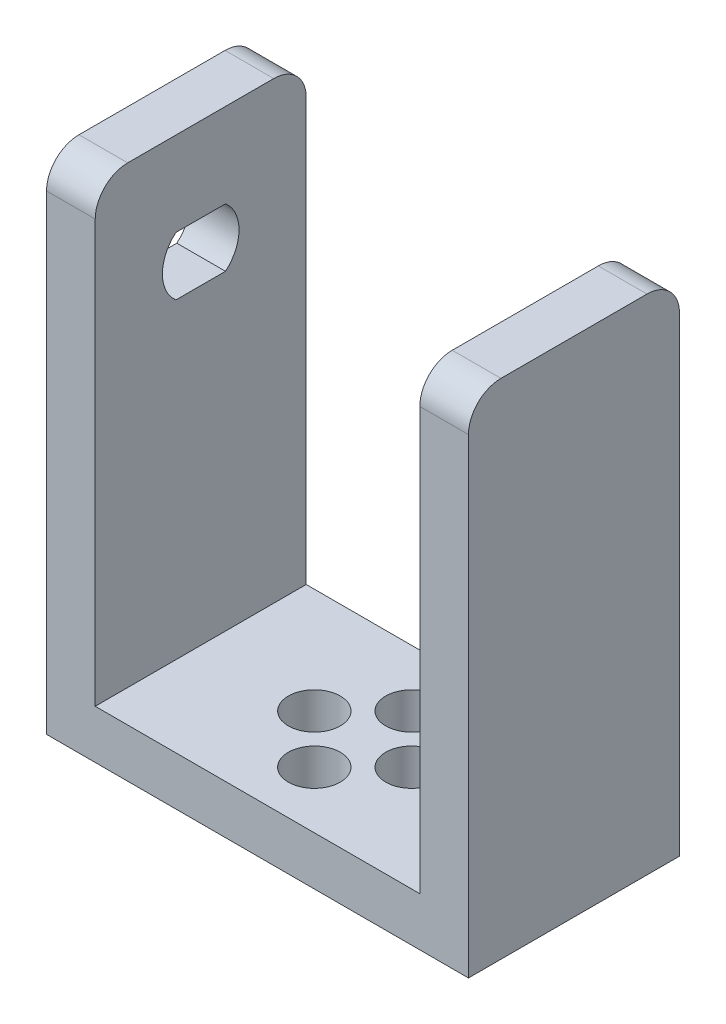
ISO-10303-21;
HEADER;
FILE_DESCRIPTION(('STEP AP214'),'2;1');
FILE_NAME('part.step','',(''),(''),'','','');
FILE_SCHEMA(('AUTOMOTIVE_DESIGN { 1 0 10303 214 1 1 1 1 }'));
ENDSEC;
DATA;
#1=APPLICATION_CONTEXT('core data for automotive mechanical design processes');
#2=APPLICATION_PROTOCOL_DEFINITION('international standard','automotive_design',2000,#1);
#3=PRODUCT_CONTEXT('',#1,'mechanical');
#4=PRODUCT('Part','Part','',(#3));
#5=PRODUCT_RELATED_PRODUCT_CATEGORY('part','',(#4));
#6=PRODUCT_DEFINITION_FORMATION('','',#4);
#7=PRODUCT_DEFINITION_CONTEXT('part definition',#1,'design');
#8=PRODUCT_DEFINITION('design','',#6,#7);
#9=PRODUCT_DEFINITION_SHAPE('','',#8);
#10=(LENGTH_UNIT() NAMED_UNIT(*) SI_UNIT(.MILLI.,.METRE.));
#11=(NAMED_UNIT(*) PLANE_ANGLE_UNIT() SI_UNIT($,.RADIAN.));
#12=(NAMED_UNIT(*) SI_UNIT($,.STERADIAN.) SOLID_ANGLE_UNIT());
#13=UNCERTAINTY_MEASURE_WITH_UNIT(LENGTH_MEASURE(1.E-05),#10,'distance_accuracy_value','');
#14=(GEOMETRIC_REPRESENTATION_CONTEXT(3) GLOBAL_UNCERTAINTY_ASSIGNED_CONTEXT((#13)) GLOBAL_UNIT_ASSIGNED_CONTEXT((#10,
#11,#12)) REPRESENTATION_CONTEXT('',''));
#15=CARTESIAN_POINT('',(0.,0.,0.));
#16=DIRECTION('',(0.,0.,1.));
#17=DIRECTION('',(1.,0.,0.));
#18=AXIS2_PLACEMENT_3D('',#15,#16,#17);
#19=CARTESIAN_POINT('',(0.,3.,0.));
#20=DIRECTION('',(0.,-1.,0.));
#21=DIRECTION('',(0.,0.,-1.));
#22=AXIS2_PLACEMENT_3D('',#19,#20,#21);
#23=PLANE('',#22);
#24=DIRECTION('',(0.,0.,-1.));
#25=VECTOR('',#24,1.);
#26=CARTESIAN_POINT('',(10.,3.,6.5));
#27=LINE('',#26,#25);
#28=CARTESIAN_POINT('',(10.,3.,6.5));
#29=VERTEX_POINT('',#28);
#30=CARTESIAN_POINT('',(10.,3.,-6.5));
#31=VERTEX_POINT('',#30);
#32=EDGE_CURVE('E283',#29,#31,#27,.T.);
#33=ORIENTED_EDGE('',*,*,#32,.T.);
#34=DIRECTION('',(-1.,0.,0.));
#35=VECTOR('',#34,1.);
#36=CARTESIAN_POINT('',(-10.,3.,-6.5));
#37=LINE('',#36,#35);
#38=CARTESIAN_POINT('',(-10.,3.,-6.5));
#39=VERTEX_POINT('',#38);
#40=EDGE_CURVE('E287',#31,#39,#37,.T.);
#41=ORIENTED_EDGE('',*,*,#40,.T.);
#42=DIRECTION('',(0.,0.,1.));
#43=VECTOR('',#42,1.);
#44=CARTESIAN_POINT('',(-10.,3.,6.5));
#45=LINE('',#44,#43);
#46=CARTESIAN_POINT('',(-10.,3.,6.5));
#47=VERTEX_POINT('',#46);
#48=EDGE_CURVE('E292',#39,#47,#45,.T.);
#49=ORIENTED_EDGE('',*,*,#48,.T.);
#50=DIRECTION('',(1.,0.,0.));
#51=VECTOR('',#50,1.);
#52=CARTESIAN_POINT('',(-10.,3.,6.5));
#53=LINE('',#52,#51);
#54=EDGE_CURVE('E296',#47,#29,#53,.T.);
#55=ORIENTED_EDGE('',*,*,#54,.T.);
#56=EDGE_LOOP('',(#33,#41,#49,#55));
#57=FACE_BOUND('',#56,.T.);
#58=CARTESIAN_POINT('',(0.,3.,-3.));
#59=DIRECTION('',(0.,1.,0.));
#60=DIRECTION('',(0.,0.,1.));
#61=AXIS2_PLACEMENT_3D('',#58,#59,#60);
#62=CIRCLE('',#61,1.6);
#63=CARTESIAN_POINT('',(0.,3.,-1.4));
#64=VERTEX_POINT('',#63);
#65=EDGE_CURVE('E275',#64,#64,#62,.T.);
#66=ORIENTED_EDGE('',*,*,#65,.F.);
#67=EDGE_LOOP('',(#66));
#68=FACE_BOUND('',#67,.T.);
#69=CARTESIAN_POINT('',(3.,3.,0.));
#70=DIRECTION('',(0.,1.,0.));
#71=DIRECTION('',(0.,0.,1.));
#72=AXIS2_PLACEMENT_3D('',#69,#70,#71);
#73=CIRCLE('',#72,1.6);
#74=CARTESIAN_POINT('',(3.,3.,1.6));
#75=VERTEX_POINT('',#74);
#76=EDGE_CURVE('E267',#75,#75,#73,.T.);
#77=ORIENTED_EDGE('',*,*,#76,.F.);
#78=EDGE_LOOP('',(#77));
#79=FACE_BOUND('',#78,.T.);
#80=CARTESIAN_POINT('',(0.,3.,3.));
#81=DIRECTION('',(0.,1.,0.));
#82=DIRECTION('',(0.,0.,-1.));
#83=AXIS2_PLACEMENT_3D('',#80,#81,#82);
#84=CIRCLE('',#83,1.6);
#85=CARTESIAN_POINT('',(0.,3.,1.4));
#86=VERTEX_POINT('',#85);
#87=EDGE_CURVE('E259',#86,#86,#84,.T.);
#88=ORIENTED_EDGE('',*,*,#87,.F.);
#89=EDGE_LOOP('',(#88));
#90=FACE_BOUND('',#89,.T.);
#91=CARTESIAN_POINT('',(-3.00000000000001,3.,0.));
#92=DIRECTION('',(0.,1.,0.));
#93=DIRECTION('',(0.,0.,-1.));
#94=AXIS2_PLACEMENT_3D('',#91,#92,#93);
#95=CIRCLE('',#94,1.6);
#96=CARTESIAN_POINT('',(-3.00000000000001,3.,-1.6));
#97=VERTEX_POINT('',#96);
#98=EDGE_CURVE('E251',#97,#97,#95,.T.);
#99=ORIENTED_EDGE('',*,*,#98,.F.);
#100=EDGE_LOOP('',(#99));
#101=FACE_BOUND('',#100,.T.);
#102=ADVANCED_FACE('F39',(#57,#68,#79,#90,#101),#23,.F.);
#103=CARTESIAN_POINT('',(0.,0.,0.));
#104=DIRECTION('',(0.,-1.,0.));
#105=DIRECTION('',(0.,0.,-1.));
#106=AXIS2_PLACEMENT_3D('',#103,#104,#105);
#107=PLANE('',#106);
#108=CARTESIAN_POINT('',(0.,0.,3.));
#109=DIRECTION('',(0.,1.,0.));
#110=DIRECTION('',(0.,0.,-1.));
#111=AXIS2_PLACEMENT_3D('',#108,#109,#110);
#112=CIRCLE('',#111,1.6);
#113=CARTESIAN_POINT('',(0.,0.,1.4));
#114=VERTEX_POINT('',#113);
#115=EDGE_CURVE('E255',#114,#114,#112,.T.);
#116=ORIENTED_EDGE('',*,*,#115,.T.);
#117=EDGE_LOOP('',(#116));
#118=FACE_BOUND('',#117,.T.);
#119=CARTESIAN_POINT('',(0.,0.,-3.));
#120=DIRECTION('',(0.,1.,0.));
#121=DIRECTION('',(0.,0.,1.));
#122=AXIS2_PLACEMENT_3D('',#119,#120,#121);
#123=CIRCLE('',#122,1.6);
#124=CARTESIAN_POINT('',(0.,0.,-1.4));
#125=VERTEX_POINT('',#124);
#126=EDGE_CURVE('E271',#125,#125,#123,.T.);
#127=ORIENTED_EDGE('',*,*,#126,.T.);
#128=EDGE_LOOP('',(#127));
#129=FACE_BOUND('',#128,.T.);
#130=DIRECTION('',(-1.,0.,0.));
#131=VECTOR('',#130,1.);
#132=CARTESIAN_POINT('',(-10.,0.,-6.5));
#133=LINE('',#132,#131);
#134=CARTESIAN_POINT('',(13.,0.,-6.5));
#135=VERTEX_POINT('',#134);
#136=CARTESIAN_POINT('',(-13.,0.,-6.5));
#137=VERTEX_POINT('',#136);
#138=EDGE_CURVE('E279',#135,#137,#133,.T.);
#139=ORIENTED_EDGE('',*,*,#138,.F.);
#140=DIRECTION('',(0.,0.,-1.));
#141=VECTOR('',#140,1.);
#142=CARTESIAN_POINT('',(13.,0.,-6.5));
#143=LINE('',#142,#141);
#144=CARTESIAN_POINT('',(13.,0.,6.5));
#145=VERTEX_POINT('',#144);
#146=EDGE_CURVE('E200',#145,#135,#143,.T.);
#147=ORIENTED_EDGE('',*,*,#146,.F.);
#148=DIRECTION('',(1.,0.,0.));
#149=VECTOR('',#148,1.);
#150=CARTESIAN_POINT('',(-10.,0.,6.5));
#151=LINE('',#150,#149);
#152=CARTESIAN_POINT('',(-13.,0.,6.5));
#153=VERTEX_POINT('',#152);
#154=EDGE_CURVE('E288',#153,#145,#151,.T.);
#155=ORIENTED_EDGE('',*,*,#154,.F.);
#156=DIRECTION('',(0.,0.,1.));
#157=VECTOR('',#156,1.);
#158=CARTESIAN_POINT('',(-13.,0.,-6.5));
#159=LINE('',#158,#157);
#160=EDGE_CURVE('E227',#137,#153,#159,.T.);
#161=ORIENTED_EDGE('',*,*,#160,.F.);
#162=EDGE_LOOP('',(#139,#147,#155,#161));
#163=FACE_BOUND('',#162,.T.);
#164=CARTESIAN_POINT('',(3.,0.,0.));
#165=DIRECTION('',(0.,1.,0.));
#166=DIRECTION('',(0.,0.,1.));
#167=AXIS2_PLACEMENT_3D('',#164,#165,#166);
#168=CIRCLE('',#167,1.6);
#169=CARTESIAN_POINT('',(3.,0.,1.6));
#170=VERTEX_POINT('',#169);
#171=EDGE_CURVE('E263',#170,#170,#168,.T.);
#172=ORIENTED_EDGE('',*,*,#171,.T.);
#173=EDGE_LOOP('',(#172));
#174=FACE_BOUND('',#173,.T.);
#175=CARTESIAN_POINT('',(-3.00000000000001,0.,0.));
#176=DIRECTION('',(0.,1.,0.));
#177=DIRECTION('',(0.,0.,-1.));
#178=AXIS2_PLACEMENT_3D('',#175,#176,#177);
#179=CIRCLE('',#178,1.6);
#180=CARTESIAN_POINT('',(-3.00000000000001,0.,-1.6));
#181=VERTEX_POINT('',#180);
#182=EDGE_CURVE('E250',#181,#181,#179,.T.);
#183=ORIENTED_EDGE('',*,*,#182,.T.);
#184=EDGE_LOOP('',(#183));
#185=FACE_BOUND('',#184,.T.);
#186=ADVANCED_FACE('F412',(#118,#129,#163,#174,#185),#107,.T.);
#187=CARTESIAN_POINT('',(-10.,3.,-6.5));
#188=DIRECTION('',(0.,0.,1.));
#189=DIRECTION('',(1.,0.,0.));
#190=AXIS2_PLACEMENT_3D('',#187,#188,#189);
#191=PLANE('',#190);
#192=DIRECTION('',(0.,-1.,0.));
#193=VECTOR('',#192,1.);
#194=CARTESIAN_POINT('',(10.,31.,-6.5));
#195=LINE('',#194,#193);
#196=CARTESIAN_POINT('',(10.,29.,-6.5));
#197=VERTEX_POINT('',#196);
#198=EDGE_CURVE('E212',#197,#31,#195,.T.);
#199=ORIENTED_EDGE('',*,*,#198,.F.);
#200=DIRECTION('',(-1.,0.,0.));
#201=VECTOR('',#200,1.);
#202=CARTESIAN_POINT('',(13.,29.,-6.5));
#203=LINE('',#202,#201);
#204=CARTESIAN_POINT('',(13.,29.,-6.5));
#205=VERTEX_POINT('',#204);
#206=EDGE_CURVE('E336',#197,#205,#203,.F.);
#207=ORIENTED_EDGE('',*,*,#206,.T.);
#208=DIRECTION('',(0.,-1.,0.));
#209=VECTOR('',#208,1.);
#210=CARTESIAN_POINT('',(13.,31.,-6.5));
#211=LINE('',#210,#209);
#212=EDGE_CURVE('E218',#205,#135,#211,.T.);
#213=ORIENTED_EDGE('',*,*,#212,.T.);
#214=ORIENTED_EDGE('',*,*,#138,.T.);
#215=DIRECTION('',(0.,-1.,0.));
#216=VECTOR('',#215,1.);
#217=CARTESIAN_POINT('',(-13.,31.,-6.5));
#218=LINE('',#217,#216);
#219=CARTESIAN_POINT('',(-13.,29.,-6.5));
#220=VERTEX_POINT('',#219);
#221=EDGE_CURVE('E244',#220,#137,#218,.T.);
#222=ORIENTED_EDGE('',*,*,#221,.F.);
#223=DIRECTION('',(-1.,0.,0.));
#224=VECTOR('',#223,1.);
#225=CARTESIAN_POINT('',(-10.,29.,-6.5));
#226=LINE('',#225,#224);
#227=CARTESIAN_POINT('',(-10.,29.,-6.5));
#228=VERTEX_POINT('',#227);
#229=EDGE_CURVE('E333',#220,#228,#226,.F.);
#230=ORIENTED_EDGE('',*,*,#229,.T.);
#231=DIRECTION('',(0.,-1.,0.));
#232=VECTOR('',#231,1.);
#233=CARTESIAN_POINT('',(-10.,31.,-6.5));
#234=LINE('',#233,#232);
#235=EDGE_CURVE('E247',#228,#39,#234,.T.);
#236=ORIENTED_EDGE('',*,*,#235,.T.);
#237=ORIENTED_EDGE('',*,*,#40,.F.);
#238=EDGE_LOOP('',(#199,#207,#213,#214,#222,#230,#236,#237));
#239=FACE_BOUND('',#238,.T.);
#240=ADVANCED_FACE('F368',(#239),#191,.F.);
#241=CARTESIAN_POINT('',(-10.,3.,6.5));
#242=DIRECTION('',(0.,0.,-1.));
#243=DIRECTION('',(-1.,0.,0.));
#244=AXIS2_PLACEMENT_3D('',#241,#242,#243);
#245=PLANE('',#244);
#246=DIRECTION('',(0.,-1.,0.));
#247=VECTOR('',#246,1.);
#248=CARTESIAN_POINT('',(13.,31.,6.5));
#249=LINE('',#248,#247);
#250=CARTESIAN_POINT('',(13.,29.,6.5));
#251=VERTEX_POINT('',#250);
#252=EDGE_CURVE('E221',#251,#145,#249,.T.);
#253=ORIENTED_EDGE('',*,*,#252,.F.);
#254=DIRECTION('',(1.,0.,0.));
#255=VECTOR('',#254,1.);
#256=CARTESIAN_POINT('',(10.,29.,6.5));
#257=LINE('',#256,#255);
#258=CARTESIAN_POINT('',(10.,29.,6.5));
#259=VERTEX_POINT('',#258);
#260=EDGE_CURVE('E348',#251,#259,#257,.F.);
#261=ORIENTED_EDGE('',*,*,#260,.T.);
#262=DIRECTION('',(0.,-1.,0.));
#263=VECTOR('',#262,1.);
#264=CARTESIAN_POINT('',(10.,31.,6.5));
#265=LINE('',#264,#263);
#266=EDGE_CURVE('E224',#259,#29,#265,.T.);
#267=ORIENTED_EDGE('',*,*,#266,.T.);
#268=ORIENTED_EDGE('',*,*,#54,.F.);
#269=DIRECTION('',(0.,-1.,0.));
#270=VECTOR('',#269,1.);
#271=CARTESIAN_POINT('',(-10.,31.,6.5));
#272=LINE('',#271,#270);
#273=CARTESIAN_POINT('',(-10.,29.,6.5));
#274=VERTEX_POINT('',#273);
#275=EDGE_CURVE('E235',#274,#47,#272,.T.);
#276=ORIENTED_EDGE('',*,*,#275,.F.);
#277=DIRECTION('',(1.,0.,0.));
#278=VECTOR('',#277,1.);
#279=CARTESIAN_POINT('',(-10.,29.,6.5));
#280=LINE('',#279,#278);
#281=CARTESIAN_POINT('',(-13.,29.,6.5));
#282=VERTEX_POINT('',#281);
#283=EDGE_CURVE('E345',#274,#282,#280,.F.);
#284=ORIENTED_EDGE('',*,*,#283,.T.);
#285=DIRECTION('',(0.,-1.,0.));
#286=VECTOR('',#285,1.);
#287=CARTESIAN_POINT('',(-13.,31.,6.5));
#288=LINE('',#287,#286);
#289=EDGE_CURVE('E241',#282,#153,#288,.T.);
#290=ORIENTED_EDGE('',*,*,#289,.T.);
#291=ORIENTED_EDGE('',*,*,#154,.T.);
#292=EDGE_LOOP('',(#253,#261,#267,#268,#276,#284,#290,#291));
#293=FACE_BOUND('',#292,.T.);
#294=ADVANCED_FACE('F385',(#293),#245,.F.);
#295=CARTESIAN_POINT('',(0.,3.,-3.));
#296=DIRECTION('',(0.,-1.,0.));
#297=DIRECTION('',(0.,0.,-1.));
#298=AXIS2_PLACEMENT_3D('',#295,#296,#297);
#299=CYLINDRICAL_SURFACE('',#298,1.6);
#300=ORIENTED_EDGE('',*,*,#65,.T.);
#301=EDGE_LOOP('',(#300));
#302=FACE_BOUND('',#301,.T.);
#303=ORIENTED_EDGE('',*,*,#126,.F.);
#304=EDGE_LOOP('',(#303));
#305=FACE_BOUND('',#304,.T.);
#306=ADVANCED_FACE('F439',(#302,#305),#299,.F.);
#307=CARTESIAN_POINT('',(3.,3.,0.));
#308=DIRECTION('',(0.,-1.,0.));
#309=DIRECTION('',(0.,0.,-1.));
#310=AXIS2_PLACEMENT_3D('',#307,#308,#309);
#311=CYLINDRICAL_SURFACE('',#310,1.6);
#312=ORIENTED_EDGE('',*,*,#76,.T.);
#313=EDGE_LOOP('',(#312));
#314=FACE_BOUND('',#313,.T.);
#315=ORIENTED_EDGE('',*,*,#171,.F.);
#316=EDGE_LOOP('',(#315));
#317=FACE_BOUND('',#316,.T.);
#318=ADVANCED_FACE('F431',(#314,#317),#311,.F.);
#319=CARTESIAN_POINT('',(0.,3.,3.));
#320=DIRECTION('',(0.,-1.,0.));
#321=DIRECTION('',(0.,0.,-1.));
#322=AXIS2_PLACEMENT_3D('',#319,#320,#321);
#323=CYLINDRICAL_SURFACE('',#322,1.6);
#324=ORIENTED_EDGE('',*,*,#87,.T.);
#325=EDGE_LOOP('',(#324));
#326=FACE_BOUND('',#325,.T.);
#327=ORIENTED_EDGE('',*,*,#115,.F.);
#328=EDGE_LOOP('',(#327));
#329=FACE_BOUND('',#328,.T.);
#330=ADVANCED_FACE('F423',(#326,#329),#323,.F.);
#331=CARTESIAN_POINT('',(-3.00000000000001,3.,0.));
#332=DIRECTION('',(0.,-1.,0.));
#333=DIRECTION('',(0.,0.,-1.));
#334=AXIS2_PLACEMENT_3D('',#331,#332,#333);
#335=CYLINDRICAL_SURFACE('',#334,1.6);
#336=ORIENTED_EDGE('',*,*,#98,.T.);
#337=EDGE_LOOP('',(#336));
#338=FACE_BOUND('',#337,.T.);
#339=ORIENTED_EDGE('',*,*,#182,.F.);
#340=EDGE_LOOP('',(#339));
#341=FACE_BOUND('',#340,.T.);
#342=ADVANCED_FACE('F421',(#338,#341),#335,.F.);
#343=CARTESIAN_POINT('',(-10.,31.,-6.5));
#344=DIRECTION('',(-1.,0.,0.));
#345=DIRECTION('',(0.,0.,1.));
#346=AXIS2_PLACEMENT_3D('',#343,#344,#345);
#347=PLANE('',#346);
#348=DIRECTION('',(0.,0.,-1.));
#349=VECTOR('',#348,1.);
#350=CARTESIAN_POINT('',(-10.,22.2,-1.52630272226711));
#351=LINE('',#350,#349);
#352=CARTESIAN_POINT('',(-10.,22.2,1.52630272226711));
#353=VERTEX_POINT('',#352);
#354=CARTESIAN_POINT('',(-10.,22.2,-1.52630272226711));
#355=VERTEX_POINT('',#354);
#356=EDGE_CURVE('E170',#353,#355,#351,.T.);
#357=ORIENTED_EDGE('',*,*,#356,.F.);
#358=CARTESIAN_POINT('',(-10.,24.,0.));
#359=DIRECTION('',(1.,0.,0.));
#360=DIRECTION('',(0.,0.,-1.));
#361=AXIS2_PLACEMENT_3D('',#358,#359,#360);
#362=CIRCLE('',#361,2.36);
#363=CARTESIAN_POINT('',(-10.,25.8,1.52630272226711));
#364=VERTEX_POINT('',#363);
#365=EDGE_CURVE('E176',#364,#353,#362,.T.);
#366=ORIENTED_EDGE('',*,*,#365,.F.);
#367=DIRECTION('',(0.,0.,1.));
#368=VECTOR('',#367,1.);
#369=CARTESIAN_POINT('',(-10.,25.8,-1.52630272226711));
#370=LINE('',#369,#368);
#371=CARTESIAN_POINT('',(-10.,25.8,-1.52630272226711));
#372=VERTEX_POINT('',#371);
#373=EDGE_CURVE('E181',#372,#364,#370,.T.);
#374=ORIENTED_EDGE('',*,*,#373,.F.);
#375=CARTESIAN_POINT('',(-10.,24.,0.));
#376=DIRECTION('',(1.,0.,0.));
#377=DIRECTION('',(0.,0.,-1.));
#378=AXIS2_PLACEMENT_3D('',#375,#376,#377);
#379=CIRCLE('',#378,2.36);
#380=EDGE_CURVE('E158',#355,#372,#379,.T.);
#381=ORIENTED_EDGE('',*,*,#380,.F.);
#382=EDGE_LOOP('',(#357,#366,#374,#381));
#383=FACE_BOUND('',#382,.T.);
#384=DIRECTION('',(0.,0.,-1.));
#385=VECTOR('',#384,1.);
#386=CARTESIAN_POINT('',(-10.,31.,-6.5));
#387=LINE('',#386,#385);
#388=CARTESIAN_POINT('',(-10.,31.,4.5));
#389=VERTEX_POINT('',#388);
#390=CARTESIAN_POINT('',(-10.,31.,-4.5));
#391=VERTEX_POINT('',#390);
#392=EDGE_CURVE('E228',#389,#391,#387,.T.);
#393=ORIENTED_EDGE('',*,*,#392,.F.);
#394=CARTESIAN_POINT('',(-10.,29.,4.5));
#395=DIRECTION('',(-1.,0.,0.));
#396=DIRECTION('',(0.,0.,1.));
#397=AXIS2_PLACEMENT_3D('',#394,#395,#396);
#398=CIRCLE('',#397,2.);
#399=EDGE_CURVE('E361',#389,#274,#398,.F.);
#400=ORIENTED_EDGE('',*,*,#399,.T.);
#401=ORIENTED_EDGE('',*,*,#275,.T.);
#402=ORIENTED_EDGE('',*,*,#48,.F.);
#403=ORIENTED_EDGE('',*,*,#235,.F.);
#404=CARTESIAN_POINT('',(-10.,29.,-4.5));
#405=DIRECTION('',(-1.,0.,0.));
#406=DIRECTION('',(0.,0.,1.));
#407=AXIS2_PLACEMENT_3D('',#404,#405,#406);
#408=CIRCLE('',#407,2.);
#409=EDGE_CURVE('E358',#228,#391,#408,.F.);
#410=ORIENTED_EDGE('',*,*,#409,.T.);
#411=EDGE_LOOP('',(#393,#400,#401,#402,#403,#410));
#412=FACE_BOUND('',#411,.T.);
#413=ADVANCED_FACE('F178',(#383,#412),#347,.F.);
#414=CARTESIAN_POINT('',(-13.,31.,-6.5));
#415=DIRECTION('',(1.,0.,0.));
#416=DIRECTION('',(0.,0.,-1.));
#417=AXIS2_PLACEMENT_3D('',#414,#415,#416);
#418=PLANE('',#417);
#419=DIRECTION('',(0.,0.,1.));
#420=VECTOR('',#419,1.);
#421=CARTESIAN_POINT('',(-13.,25.8,-6.5));
#422=LINE('',#421,#420);
#423=CARTESIAN_POINT('',(-13.,25.8,-1.52630272226711));
#424=VERTEX_POINT('',#423);
#425=CARTESIAN_POINT('',(-13.,25.8,1.52630272226711));
#426=VERTEX_POINT('',#425);
#427=EDGE_CURVE('E311',#424,#426,#422,.T.);
#428=ORIENTED_EDGE('',*,*,#427,.T.);
#429=CARTESIAN_POINT('',(-13.,24.,0.));
#430=DIRECTION('',(1.,0.,0.));
#431=DIRECTION('',(0.,0.,-1.));
#432=AXIS2_PLACEMENT_3D('',#429,#430,#431);
#433=CIRCLE('',#432,2.36);
#434=CARTESIAN_POINT('',(-13.,22.2,1.52630272226711));
#435=VERTEX_POINT('',#434);
#436=EDGE_CURVE('E315',#426,#435,#433,.T.);
#437=ORIENTED_EDGE('',*,*,#436,.T.);
#438=DIRECTION('',(0.,0.,-1.));
#439=VECTOR('',#438,1.);
#440=CARTESIAN_POINT('',(-13.,22.2,-6.5));
#441=LINE('',#440,#439);
#442=CARTESIAN_POINT('',(-13.,22.2,-1.52630272226711));
#443=VERTEX_POINT('',#442);
#444=EDGE_CURVE('E300',#435,#443,#441,.T.);
#445=ORIENTED_EDGE('',*,*,#444,.T.);
#446=CARTESIAN_POINT('',(-13.,24.,0.));
#447=DIRECTION('',(1.,0.,0.));
#448=DIRECTION('',(0.,0.,-1.));
#449=AXIS2_PLACEMENT_3D('',#446,#447,#448);
#450=CIRCLE('',#449,2.36);
#451=EDGE_CURVE('E161',#443,#424,#450,.T.);
#452=ORIENTED_EDGE('',*,*,#451,.T.);
#453=EDGE_LOOP('',(#428,#437,#445,#452));
#454=FACE_BOUND('',#453,.T.);
#455=ORIENTED_EDGE('',*,*,#289,.F.);
#456=CARTESIAN_POINT('',(-13.,29.,4.5));
#457=DIRECTION('',(1.,0.,0.));
#458=DIRECTION('',(0.,0.,-1.));
#459=AXIS2_PLACEMENT_3D('',#456,#457,#458);
#460=CIRCLE('',#459,2.);
#461=CARTESIAN_POINT('',(-13.,31.,4.5));
#462=VERTEX_POINT('',#461);
#463=EDGE_CURVE('E11',#282,#462,#460,.F.);
#464=ORIENTED_EDGE('',*,*,#463,.T.);
#465=DIRECTION('',(0.,0.,1.));
#466=VECTOR('',#465,1.);
#467=CARTESIAN_POINT('',(-13.,31.,-6.5));
#468=LINE('',#467,#466);
#469=CARTESIAN_POINT('',(-13.,31.,-4.5));
#470=VERTEX_POINT('',#469);
#471=EDGE_CURVE('E232',#470,#462,#468,.T.);
#472=ORIENTED_EDGE('',*,*,#471,.F.);
#473=CARTESIAN_POINT('',(-13.,29.,-4.5));
#474=DIRECTION('',(1.,0.,0.));
#475=DIRECTION('',(0.,0.,-1.));
#476=AXIS2_PLACEMENT_3D('',#473,#474,#475);
#477=CIRCLE('',#476,2.);
#478=EDGE_CURVE('E48',#470,#220,#477,.F.);
#479=ORIENTED_EDGE('',*,*,#478,.T.);
#480=ORIENTED_EDGE('',*,*,#221,.T.);
#481=ORIENTED_EDGE('',*,*,#160,.T.);
#482=EDGE_LOOP('',(#455,#464,#472,#479,#480,#481));
#483=FACE_BOUND('',#482,.T.);
#484=ADVANCED_FACE('F365',(#454,#483),#418,.F.);
#485=CARTESIAN_POINT('',(0.,31.,0.));
#486=DIRECTION('',(0.,-1.,0.));
#487=DIRECTION('',(0.,0.,-1.));
#488=AXIS2_PLACEMENT_3D('',#485,#486,#487);
#489=PLANE('',#488);
#490=ORIENTED_EDGE('',*,*,#471,.T.);
#491=DIRECTION('',(1.,0.,0.));
#492=VECTOR('',#491,1.);
#493=CARTESIAN_POINT('',(0.,31.,4.5));
#494=LINE('',#493,#492);
#495=EDGE_CURVE('E354',#462,#389,#494,.T.);
#496=ORIENTED_EDGE('',*,*,#495,.T.);
#497=ORIENTED_EDGE('',*,*,#392,.T.);
#498=DIRECTION('',(-1.,0.,0.));
#499=VECTOR('',#498,1.);
#500=CARTESIAN_POINT('',(0.,31.,-4.5));
#501=LINE('',#500,#499);
#502=EDGE_CURVE('E351',#391,#470,#501,.T.);
#503=ORIENTED_EDGE('',*,*,#502,.T.);
#504=EDGE_LOOP('',(#490,#496,#497,#503));
#505=FACE_BOUND('',#504,.T.);
#506=ADVANCED_FACE('F376',(#505),#489,.F.);
#507=CARTESIAN_POINT('',(10.,31.,-6.5));
#508=DIRECTION('',(1.,0.,0.));
#509=DIRECTION('',(0.,0.,-1.));
#510=AXIS2_PLACEMENT_3D('',#507,#508,#509);
#511=PLANE('',#510);
#512=CARTESIAN_POINT('',(10.,24.,0.));
#513=DIRECTION('',(-1.,0.,0.));
#514=DIRECTION('',(0.,0.,1.));
#515=AXIS2_PLACEMENT_3D('',#512,#513,#514);
#516=CIRCLE('',#515,4.13);
#517=CARTESIAN_POINT('',(10.,24.,4.13));
#518=VERTEX_POINT('',#517);
#519=EDGE_CURVE('E191',#518,#518,#516,.T.);
#520=ORIENTED_EDGE('',*,*,#519,.F.);
#521=EDGE_LOOP('',(#520));
#522=FACE_BOUND('',#521,.T.);
#523=DIRECTION('',(0.,0.,1.));
#524=VECTOR('',#523,1.);
#525=CARTESIAN_POINT('',(10.,31.,-6.5));
#526=LINE('',#525,#524);
#527=CARTESIAN_POINT('',(10.,31.,-4.5));
#528=VERTEX_POINT('',#527);
#529=CARTESIAN_POINT('',(10.,31.,4.5));
#530=VERTEX_POINT('',#529);
#531=EDGE_CURVE('E204',#528,#530,#526,.T.);
#532=ORIENTED_EDGE('',*,*,#531,.F.);
#533=CARTESIAN_POINT('',(10.,29.,-4.5));
#534=DIRECTION('',(1.,0.,0.));
#535=DIRECTION('',(0.,0.,-1.));
#536=AXIS2_PLACEMENT_3D('',#533,#534,#535);
#537=CIRCLE('',#536,2.);
#538=EDGE_CURVE('E330',#528,#197,#537,.F.);
#539=ORIENTED_EDGE('',*,*,#538,.T.);
#540=ORIENTED_EDGE('',*,*,#198,.T.);
#541=ORIENTED_EDGE('',*,*,#32,.F.);
#542=ORIENTED_EDGE('',*,*,#266,.F.);
#543=CARTESIAN_POINT('',(10.,29.,4.5));
#544=DIRECTION('',(1.,0.,0.));
#545=DIRECTION('',(0.,0.,-1.));
#546=AXIS2_PLACEMENT_3D('',#543,#544,#545);
#547=CIRCLE('',#546,2.);
#548=EDGE_CURVE('E327',#259,#530,#547,.F.);
#549=ORIENTED_EDGE('',*,*,#548,.T.);
#550=EDGE_LOOP('',(#532,#539,#540,#541,#542,#549));
#551=FACE_BOUND('',#550,.T.);
#552=ADVANCED_FACE('F493',(#522,#551),#511,.F.);
#553=CARTESIAN_POINT('',(13.,31.,-6.5));
#554=DIRECTION('',(-1.,0.,0.));
#555=DIRECTION('',(0.,0.,1.));
#556=AXIS2_PLACEMENT_3D('',#553,#554,#555);
#557=PLANE('',#556);
#558=ORIENTED_EDGE('',*,*,#212,.F.);
#559=CARTESIAN_POINT('',(13.,29.,-4.5));
#560=DIRECTION('',(-1.,0.,0.));
#561=DIRECTION('',(0.,0.,1.));
#562=AXIS2_PLACEMENT_3D('',#559,#560,#561);
#563=CIRCLE('',#562,2.);
#564=CARTESIAN_POINT('',(13.,31.,-4.5));
#565=VERTEX_POINT('',#564);
#566=EDGE_CURVE('E342',#205,#565,#563,.F.);
#567=ORIENTED_EDGE('',*,*,#566,.T.);
#568=DIRECTION('',(0.,0.,-1.));
#569=VECTOR('',#568,1.);
#570=CARTESIAN_POINT('',(13.,31.,-6.5));
#571=LINE('',#570,#569);
#572=CARTESIAN_POINT('',(13.,31.,4.5));
#573=VERTEX_POINT('',#572);
#574=EDGE_CURVE('E208',#573,#565,#571,.T.);
#575=ORIENTED_EDGE('',*,*,#574,.F.);
#576=CARTESIAN_POINT('',(13.,29.,4.5));
#577=DIRECTION('',(-1.,0.,0.));
#578=DIRECTION('',(0.,0.,1.));
#579=AXIS2_PLACEMENT_3D('',#576,#577,#578);
#580=CIRCLE('',#579,2.);
#581=EDGE_CURVE('E339',#573,#251,#580,.F.);
#582=ORIENTED_EDGE('',*,*,#581,.T.);
#583=ORIENTED_EDGE('',*,*,#252,.T.);
#584=ORIENTED_EDGE('',*,*,#146,.T.);
#585=EDGE_LOOP('',(#558,#567,#575,#582,#583,#584));
#586=FACE_BOUND('',#585,.T.);
#587=ADVANCED_FACE('F400',(#586),#557,.F.);
#588=CARTESIAN_POINT('',(0.,31.,0.));
#589=DIRECTION('',(0.,1.,0.));
#590=DIRECTION('',(0.,0.,1.));
#591=AXIS2_PLACEMENT_3D('',#588,#589,#590);
#592=PLANE('',#591);
#593=ORIENTED_EDGE('',*,*,#574,.T.);
#594=DIRECTION('',(-1.,0.,0.));
#595=VECTOR('',#594,1.);
#596=CARTESIAN_POINT('',(10.,31.,-4.5));
#597=LINE('',#596,#595);
#598=EDGE_CURVE('E323',#565,#528,#597,.T.);
#599=ORIENTED_EDGE('',*,*,#598,.T.);
#600=ORIENTED_EDGE('',*,*,#531,.T.);
#601=DIRECTION('',(1.,0.,0.));
#602=VECTOR('',#601,1.);
#603=CARTESIAN_POINT('',(13.,31.,4.5));
#604=LINE('',#603,#602);
#605=EDGE_CURVE('E319',#530,#573,#604,.T.);
#606=ORIENTED_EDGE('',*,*,#605,.T.);
#607=EDGE_LOOP('',(#593,#599,#600,#606));
#608=FACE_BOUND('',#607,.T.);
#609=ADVANCED_FACE('F402',(#608),#592,.T.);
#610=CARTESIAN_POINT('',(11.5,24.,0.));
#611=DIRECTION('',(-1.,0.,0.));
#612=DIRECTION('',(0.,0.,1.));
#613=AXIS2_PLACEMENT_3D('',#610,#611,#612);
#614=CYLINDRICAL_SURFACE('',#613,4.13);
#615=CARTESIAN_POINT('',(11.5,24.,0.));
#616=DIRECTION('',(-1.,0.,0.));
#617=DIRECTION('',(0.,0.,1.));
#618=AXIS2_PLACEMENT_3D('',#615,#616,#617);
#619=CIRCLE('',#618,4.13);
#620=CARTESIAN_POINT('',(11.5,24.,4.13));
#621=VERTEX_POINT('',#620);
#622=EDGE_CURVE('E196',#621,#621,#619,.T.);
#623=ORIENTED_EDGE('',*,*,#622,.F.);
#624=EDGE_LOOP('',(#623));
#625=FACE_BOUND('',#624,.T.);
#626=ORIENTED_EDGE('',*,*,#519,.T.);
#627=EDGE_LOOP('',(#626));
#628=FACE_BOUND('',#627,.T.);
#629=ADVANCED_FACE('F482',(#625,#628),#614,.F.);
#630=CARTESIAN_POINT('',(11.5,24.,0.));
#631=DIRECTION('',(-1.,0.,0.));
#632=DIRECTION('',(0.,0.,1.));
#633=AXIS2_PLACEMENT_3D('',#630,#631,#632);
#634=PLANE('',#633);
#635=ORIENTED_EDGE('',*,*,#622,.T.);
#636=EDGE_LOOP('',(#635));
#637=FACE_BOUND('',#636,.T.);
#638=ADVANCED_FACE('F574',(#637),#634,.T.);
#639=CARTESIAN_POINT('',(-20.,24.,0.));
#640=DIRECTION('',(1.,0.,0.));
#641=DIRECTION('',(0.,0.,-1.));
#642=AXIS2_PLACEMENT_3D('',#639,#640,#641);
#643=CYLINDRICAL_SURFACE('',#642,2.36);
#644=DIRECTION('',(1.,0.,0.));
#645=VECTOR('',#644,1.);
#646=CARTESIAN_POINT('',(-20.,25.8,1.52630272226711));
#647=LINE('',#646,#645);
#648=EDGE_CURVE('E188',#426,#364,#647,.T.);
#649=ORIENTED_EDGE('',*,*,#648,.T.);
#650=ORIENTED_EDGE('',*,*,#365,.T.);
#651=DIRECTION('',(1.,0.,0.));
#652=VECTOR('',#651,1.);
#653=CARTESIAN_POINT('',(-20.,22.2,1.52630272226711));
#654=LINE('',#653,#652);
#655=EDGE_CURVE('E166',#435,#353,#654,.T.);
#656=ORIENTED_EDGE('',*,*,#655,.F.);
#657=ORIENTED_EDGE('',*,*,#436,.F.);
#658=EDGE_LOOP('',(#649,#650,#656,#657));
#659=FACE_BOUND('',#658,.T.);
#660=ADVANCED_FACE('F564',(#659),#643,.F.);
#661=CARTESIAN_POINT('',(-20.,25.8,-1.52630272226711));
#662=DIRECTION('',(0.,1.,0.));
#663=DIRECTION('',(0.,0.,1.));
#664=AXIS2_PLACEMENT_3D('',#661,#662,#663);
#665=PLANE('',#664);
#666=DIRECTION('',(1.,0.,0.));
#667=VECTOR('',#666,1.);
#668=CARTESIAN_POINT('',(-20.,25.8,-1.52630272226711));
#669=LINE('',#668,#667);
#670=EDGE_CURVE('E165',#424,#372,#669,.T.);
#671=ORIENTED_EDGE('',*,*,#670,.T.);
#672=ORIENTED_EDGE('',*,*,#373,.T.);
#673=ORIENTED_EDGE('',*,*,#648,.F.);
#674=ORIENTED_EDGE('',*,*,#427,.F.);
#675=EDGE_LOOP('',(#671,#672,#673,#674));
#676=FACE_BOUND('',#675,.T.);
#677=ADVANCED_FACE('F555',(#676),#665,.F.);
#678=CARTESIAN_POINT('',(-20.,24.,0.));
#679=DIRECTION('',(1.,0.,0.));
#680=DIRECTION('',(0.,0.,-1.));
#681=AXIS2_PLACEMENT_3D('',#678,#679,#680);
#682=CYLINDRICAL_SURFACE('',#681,2.36);
#683=DIRECTION('',(1.,0.,0.));
#684=VECTOR('',#683,1.);
#685=CARTESIAN_POINT('',(-20.,22.2,-1.52630272226711));
#686=LINE('',#685,#684);
#687=EDGE_CURVE('E153',#443,#355,#686,.T.);
#688=ORIENTED_EDGE('',*,*,#687,.T.);
#689=ORIENTED_EDGE('',*,*,#380,.T.);
#690=ORIENTED_EDGE('',*,*,#670,.F.);
#691=ORIENTED_EDGE('',*,*,#451,.F.);
#692=EDGE_LOOP('',(#688,#689,#690,#691));
#693=FACE_BOUND('',#692,.T.);
#694=ADVANCED_FACE('F155',(#693),#682,.F.);
#695=CARTESIAN_POINT('',(-20.,22.2,-1.52630272226711));
#696=DIRECTION('',(0.,-1.,0.));
#697=DIRECTION('',(0.,0.,-1.));
#698=AXIS2_PLACEMENT_3D('',#695,#696,#697);
#699=PLANE('',#698);
#700=ORIENTED_EDGE('',*,*,#655,.T.);
#701=ORIENTED_EDGE('',*,*,#356,.T.);
#702=ORIENTED_EDGE('',*,*,#687,.F.);
#703=ORIENTED_EDGE('',*,*,#444,.F.);
#704=EDGE_LOOP('',(#700,#701,#702,#703));
#705=FACE_BOUND('',#704,.T.);
#706=ADVANCED_FACE('F171',(#705),#699,.F.);
#707=CARTESIAN_POINT('',(0.,29.,-4.5));
#708=DIRECTION('',(1.,0.,0.));
#709=DIRECTION('',(0.,0.,-1.));
#710=AXIS2_PLACEMENT_3D('',#707,#708,#709);
#711=CYLINDRICAL_SURFACE('',#710,2.);
#712=ORIENTED_EDGE('',*,*,#566,.F.);
#713=ORIENTED_EDGE('',*,*,#206,.F.);
#714=ORIENTED_EDGE('',*,*,#538,.F.);
#715=ORIENTED_EDGE('',*,*,#598,.F.);
#716=EDGE_LOOP('',(#712,#713,#714,#715));
#717=FACE_BOUND('',#716,.T.);
#718=ADVANCED_FACE('F396',(#717),#711,.T.);
#719=CARTESIAN_POINT('',(0.,29.,4.5));
#720=DIRECTION('',(-1.,0.,0.));
#721=DIRECTION('',(0.,0.,1.));
#722=AXIS2_PLACEMENT_3D('',#719,#720,#721);
#723=CYLINDRICAL_SURFACE('',#722,2.);
#724=ORIENTED_EDGE('',*,*,#548,.F.);
#725=ORIENTED_EDGE('',*,*,#260,.F.);
#726=ORIENTED_EDGE('',*,*,#581,.F.);
#727=ORIENTED_EDGE('',*,*,#605,.F.);
#728=EDGE_LOOP('',(#724,#725,#726,#727));
#729=FACE_BOUND('',#728,.T.);
#730=ADVANCED_FACE('F407',(#729),#723,.T.);
#731=CARTESIAN_POINT('',(0.,29.,4.5));
#732=DIRECTION('',(1.,0.,0.));
#733=DIRECTION('',(0.,0.,-1.));
#734=AXIS2_PLACEMENT_3D('',#731,#732,#733);
#735=CYLINDRICAL_SURFACE('',#734,2.);
#736=ORIENTED_EDGE('',*,*,#463,.F.);
#737=ORIENTED_EDGE('',*,*,#283,.F.);
#738=ORIENTED_EDGE('',*,*,#399,.F.);
#739=ORIENTED_EDGE('',*,*,#495,.F.);
#740=EDGE_LOOP('',(#736,#737,#738,#739));
#741=FACE_BOUND('',#740,.T.);
#742=ADVANCED_FACE('F379',(#741),#735,.T.);
#743=CARTESIAN_POINT('',(0.,29.,-4.5));
#744=DIRECTION('',(-1.,0.,0.));
#745=DIRECTION('',(0.,0.,1.));
#746=AXIS2_PLACEMENT_3D('',#743,#744,#745);
#747=CYLINDRICAL_SURFACE('',#746,2.);
#748=ORIENTED_EDGE('',*,*,#409,.F.);
#749=ORIENTED_EDGE('',*,*,#229,.F.);
#750=ORIENTED_EDGE('',*,*,#478,.F.);
#751=ORIENTED_EDGE('',*,*,#502,.F.);
#752=EDGE_LOOP('',(#748,#749,#750,#751));
#753=FACE_BOUND('',#752,.T.);
#754=ADVANCED_FACE('F41',(#753),#747,.T.);
#755=CLOSED_SHELL('',(#102,#186,#240,#294,#306,#318,#330,#342,#413,#484,#506,#552,#587,#609,
#629,#638,#660,#677,#694,#706,#718,#730,#742,#754));
#756=MANIFOLD_SOLID_BREP('B2',#755);
#757=ADVANCED_BREP_SHAPE_REPRESENTATION('',(#18,#756),#14);
#758=SHAPE_DEFINITION_REPRESENTATION(#9,#757);
ENDSEC;
END-ISO-10303-21;
